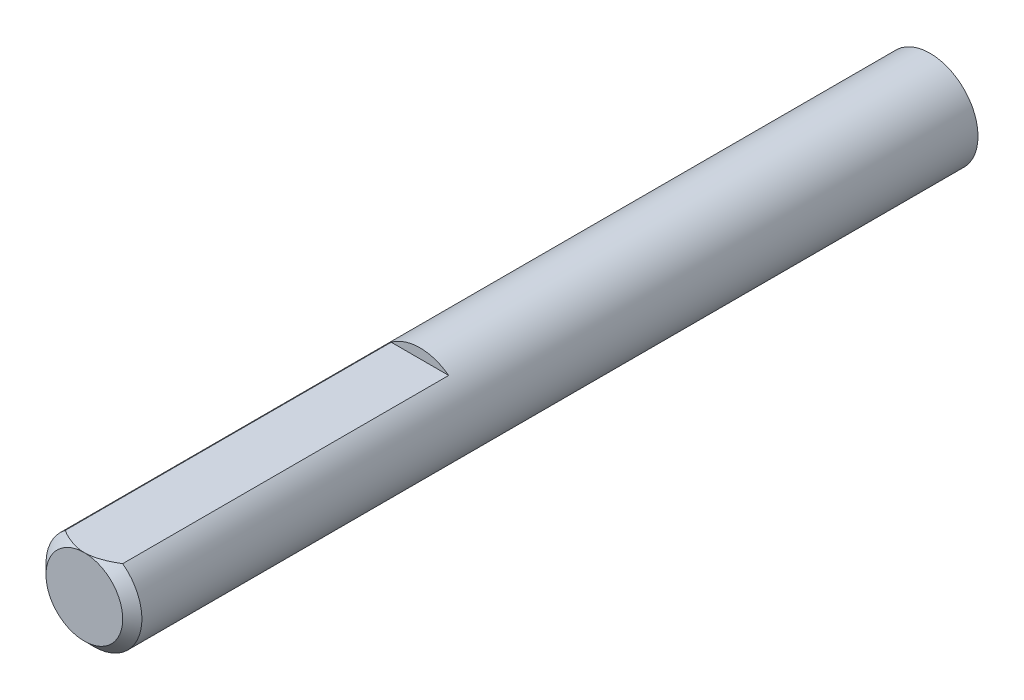
ISO-10303-21;
HEADER;
FILE_DESCRIPTION(('STEP AP214'),'2;1');
FILE_NAME('part.step','',(''),(''),'','','');
FILE_SCHEMA(('AUTOMOTIVE_DESIGN { 1 0 10303 214 1 1 1 1 }'));
ENDSEC;
DATA;
#1=APPLICATION_CONTEXT('core data for automotive mechanical design processes');
#2=APPLICATION_PROTOCOL_DEFINITION('international standard','automotive_design',2000,#1);
#3=PRODUCT_CONTEXT('',#1,'mechanical');
#4=PRODUCT('Part','Part','',(#3));
#5=PRODUCT_RELATED_PRODUCT_CATEGORY('part','',(#4));
#6=PRODUCT_DEFINITION_FORMATION('','',#4);
#7=PRODUCT_DEFINITION_CONTEXT('part definition',#1,'design');
#8=PRODUCT_DEFINITION('design','',#6,#7);
#9=PRODUCT_DEFINITION_SHAPE('','',#8);
#10=(LENGTH_UNIT() NAMED_UNIT(*) SI_UNIT(.MILLI.,.METRE.));
#11=(NAMED_UNIT(*) PLANE_ANGLE_UNIT() SI_UNIT($,.RADIAN.));
#12=(NAMED_UNIT(*) SI_UNIT($,.STERADIAN.) SOLID_ANGLE_UNIT());
#13=UNCERTAINTY_MEASURE_WITH_UNIT(LENGTH_MEASURE(1.E-05),#10,'distance_accuracy_value','');
#14=(GEOMETRIC_REPRESENTATION_CONTEXT(3) GLOBAL_UNCERTAINTY_ASSIGNED_CONTEXT((#13)) GLOBAL_UNIT_ASSIGNED_CONTEXT((#10,
#11,#12)) REPRESENTATION_CONTEXT('',''));
#15=CARTESIAN_POINT('',(0.,0.,0.));
#16=DIRECTION('',(0.,0.,1.));
#17=DIRECTION('',(1.,0.,0.));
#18=AXIS2_PLACEMENT_3D('',#15,#16,#17);
#19=CARTESIAN_POINT('',(0.,0.,44.1));
#20=DIRECTION('',(0.,0.,-1.));
#21=DIRECTION('',(-1.,0.,0.));
#22=AXIS2_PLACEMENT_3D('',#19,#20,#21);
#23=CYLINDRICAL_SURFACE('',#22,2.5);
#24=CARTESIAN_POINT('',(0.,0.,43.6));
#25=DIRECTION('',(0.,0.,1.));
#26=DIRECTION('',(1.,0.,0.));
#27=AXIS2_PLACEMENT_3D('',#24,#25,#26);
#28=CIRCLE('',#27,2.5);
#29=CARTESIAN_POINT('',(1.5,2.,43.6));
#30=VERTEX_POINT('',#29);
#31=CARTESIAN_POINT('',(-1.50000000000003,2.,43.6));
#32=VERTEX_POINT('',#31);
#33=EDGE_CURVE('E78',#30,#32,#28,.F.);
#34=ORIENTED_EDGE('',*,*,#33,.T.);
#35=DIRECTION('',(0.,0.,-1.));
#36=VECTOR('',#35,1.);
#37=CARTESIAN_POINT('',(-1.5,2.,44.1));
#38=LINE('',#37,#36);
#39=CARTESIAN_POINT('',(-1.5,2.,26.6));
#40=VERTEX_POINT('',#39);
#41=EDGE_CURVE('E58',#32,#40,#38,.T.);
#42=ORIENTED_EDGE('',*,*,#41,.T.);
#43=CARTESIAN_POINT('',(0.,0.,26.6));
#44=DIRECTION('',(0.,0.,-1.));
#45=DIRECTION('',(-1.,0.,0.));
#46=AXIS2_PLACEMENT_3D('',#43,#44,#45);
#47=CIRCLE('',#46,2.5);
#48=CARTESIAN_POINT('',(1.5,2.,26.6));
#49=VERTEX_POINT('',#48);
#50=EDGE_CURVE('E13',#40,#49,#47,.T.);
#51=ORIENTED_EDGE('',*,*,#50,.T.);
#52=DIRECTION('',(0.,0.,-1.));
#53=VECTOR('',#52,1.);
#54=CARTESIAN_POINT('',(1.5,2.,44.1));
#55=LINE('',#54,#53);
#56=EDGE_CURVE('E73',#49,#30,#55,.F.);
#57=ORIENTED_EDGE('',*,*,#56,.T.);
#58=EDGE_LOOP('',(#34,#42,#51,#57));
#59=FACE_BOUND('',#58,.T.);
#60=CARTESIAN_POINT('',(0.,0.,0.));
#61=DIRECTION('',(0.,0.,1.));
#62=DIRECTION('',(1.,0.,0.));
#63=AXIS2_PLACEMENT_3D('',#60,#61,#62);
#64=CIRCLE('',#63,2.5);
#65=CARTESIAN_POINT('',(2.5,0.,0.));
#66=VERTEX_POINT('',#65);
#67=EDGE_CURVE('E79',#66,#66,#64,.T.);
#68=ORIENTED_EDGE('',*,*,#67,.T.);
#69=EDGE_LOOP('',(#68));
#70=FACE_BOUND('',#69,.T.);
#71=ADVANCED_FACE('F38',(#59,#70),#23,.T.);
#72=CARTESIAN_POINT('',(0.,0.,44.1));
#73=DIRECTION('',(0.,0.,1.));
#74=DIRECTION('',(1.,0.,0.));
#75=AXIS2_PLACEMENT_3D('',#72,#73,#74);
#76=PLANE('',#75);
#77=CARTESIAN_POINT('',(0.,0.,44.1));
#78=DIRECTION('',(0.,0.,1.));
#79=DIRECTION('',(1.,0.,0.));
#80=AXIS2_PLACEMENT_3D('',#77,#78,#79);
#81=CIRCLE('',#80,2.);
#82=CARTESIAN_POINT('',(0.,2.,44.1));
#83=VERTEX_POINT('',#82);
#84=EDGE_CURVE('E82',#83,#83,#81,.T.);
#85=ORIENTED_EDGE('',*,*,#84,.T.);
#86=EDGE_LOOP('',(#85));
#87=FACE_BOUND('',#86,.T.);
#88=ADVANCED_FACE('F98',(#87),#76,.T.);
#89=CARTESIAN_POINT('',(0.,0.,0.));
#90=DIRECTION('',(0.,0.,1.));
#91=DIRECTION('',(1.,0.,0.));
#92=AXIS2_PLACEMENT_3D('',#89,#90,#91);
#93=PLANE('',#92);
#94=ORIENTED_EDGE('',*,*,#67,.F.);
#95=EDGE_LOOP('',(#94));
#96=FACE_BOUND('',#95,.T.);
#97=ADVANCED_FACE('F101',(#96),#93,.F.);
#98=CARTESIAN_POINT('',(0.,0.,44.1));
#99=DIRECTION('',(0.,0.,-1.));
#100=DIRECTION('',(-1.,0.,0.));
#101=AXIS2_PLACEMENT_3D('',#98,#99,#100);
#102=CONICAL_SURFACE('',#101,2.,0.785398163397448);
#103=CARTESIAN_POINT('',(-4.02524487287734,2.,41.6052701653353));
#104=CARTESIAN_POINT('',(-3.93338656559504,2.,41.6875217206694));
#105=CARTESIAN_POINT('',(-3.84126127996535,2.,41.7694777630483));
#106=CARTESIAN_POINT('',(-3.65633622016194,2.,41.9326420150682));
#107=CARTESIAN_POINT('',(-3.56353638507524,2.,42.0138501556327));
#108=CARTESIAN_POINT('',(-3.3767906548413,2.,42.1756480230057));
#109=CARTESIAN_POINT('',(-3.28284177522377,2.,42.2562343111819));
#110=CARTESIAN_POINT('',(-3.0939617004644,2.,42.416241356936));
#111=CARTESIAN_POINT('',(-2.99903054598731,2.,42.4956621624367));
#112=CARTESIAN_POINT('',(-2.80231868574972,2.,42.6576618695362));
#113=CARTESIAN_POINT('',(-2.70046395811371,2.,42.7401511403073));
#114=CARTESIAN_POINT('',(-2.49502065799542,2.,42.9029394966641));
#115=CARTESIAN_POINT('',(-2.39143218029122,2.,42.9832387013461));
#116=CARTESIAN_POINT('',(-2.18217141569414,2.,43.1407552208728));
#117=CARTESIAN_POINT('',(-2.07650249233658,2.,43.2179769835108));
#118=CARTESIAN_POINT('',(-1.86228016066993,2.,43.3682890730739));
#119=CARTESIAN_POINT('',(-1.75372763555551,2.,43.4413806440337));
#120=CARTESIAN_POINT('',(-1.56257875752937,2.,43.5627220691165));
#121=CARTESIAN_POINT('',(-1.48086803544078,2.,43.6123596167979));
#122=CARTESIAN_POINT('',(-1.31495821323154,2.,43.7074104299911));
#123=CARTESIAN_POINT('',(-1.23075822227053,2.,43.7528221584837));
#124=CARTESIAN_POINT('',(-1.06023902355461,2.,43.8375500940182));
#125=CARTESIAN_POINT('',(-0.973945152787862,2.,43.8769166708474));
#126=CARTESIAN_POINT('',(-0.798278775330236,2.,43.9480658869434));
#127=CARTESIAN_POINT('',(-0.708908734252925,2.,43.9798544452973));
#128=CARTESIAN_POINT('',(-0.559541387776273,2.,44.0239554616646));
#129=CARTESIAN_POINT('',(-0.500403045428476,2.,44.0391736445886));
#130=CARTESIAN_POINT('',(-0.381108626655472,2.,44.0648450536554));
#131=CARTESIAN_POINT('',(-0.32095297878292,2.,44.075300236847));
#132=CARTESIAN_POINT('',(-0.200181452597913,2.,44.0908949804001));
#133=CARTESIAN_POINT('',(-0.139568224383832,2.,44.0960547746351));
#134=CARTESIAN_POINT('',(-0.0181203079270951,2.,44.1008382229008));
#135=CARTESIAN_POINT('',(0.0427143780219909,2.,44.1004619341048));
#136=CARTESIAN_POINT('',(0.163839037596735,2.,44.094208583769));
#137=CARTESIAN_POINT('',(0.224130225918223,2.,44.0883546366807));
#138=CARTESIAN_POINT('',(0.343991547443575,2.,44.0715015109566));
#139=CARTESIAN_POINT('',(0.403561514966874,2.,44.0605011722532));
#140=CARTESIAN_POINT('',(0.52234223460209,2.,44.0337349239597));
#141=CARTESIAN_POINT('',(0.581540567552814,2.,44.0179146042934));
#142=CARTESIAN_POINT('',(0.69867136538083,2.,43.9822112796639));
#143=CARTESIAN_POINT('',(0.75660405011916,2.,43.9623289866356));
#144=CARTESIAN_POINT('',(0.88786092774522,2.,43.9128560581075));
#145=CARTESIAN_POINT('',(0.960752844289929,2.,43.88212449841));
#146=CARTESIAN_POINT('',(1.10449637010203,2.,43.8161808969026));
#147=CARTESIAN_POINT('',(1.17534687727419,2.,43.7809664885297));
#148=CARTESIAN_POINT('',(1.31542984339308,2.,43.7069247865524));
#149=CARTESIAN_POINT('',(1.38465593395358,2.,43.6680855391967));
#150=CARTESIAN_POINT('',(1.52149299869854,2.,43.5876549997551));
#151=CARTESIAN_POINT('',(1.58910373202633,2.,43.5460633007095));
#152=CARTESIAN_POINT('',(1.71962468526396,2.,43.462821493367));
#153=CARTESIAN_POINT('',(1.78260199281833,2.,43.4212760281911));
#154=CARTESIAN_POINT('',(1.90748425118695,2.,43.3365978718585));
#155=CARTESIAN_POINT('',(1.96938911660698,2.,43.293465055154));
#156=CARTESIAN_POINT('',(2.09174110166184,2.,43.2062912155001));
#157=CARTESIAN_POINT('',(2.15219622437864,2.,43.1622613860915));
#158=CARTESIAN_POINT('',(2.27230748022896,2.,43.0731570679659));
#159=CARTESIAN_POINT('',(2.33196382265286,2.,43.0280828616877));
#160=CARTESIAN_POINT('',(2.39129047517805,2.,42.9825859856802));
#161=B_SPLINE_CURVE_WITH_KNOTS('',3,(#103,#104,#105,#106,#107,#108,#109,#110,#111,#112,#113,
#114,#115,#116,#117,#118,#119,#120,#121,#122,#123,#124,#125,#126,#127,#128,#129,#130,#131,#132,
#133,#134,#135,#136,#137,#138,#139,#140,#141,#142,#143,#144,#145,#146,#147,#148,#149,#150,#151,
#152,#153,#154,#155,#156,#157,#158,#159,#160),.UNSPECIFIED.,.F.,.F.,(4,2,2,2,2,2,2,2,2,2,2,2,2,
2,2,2,2,2,2,2,2,2,2,2,2,2,2,2,4),(0.,0.369906577290639,0.739846983359822,1.11116790415774,
1.48247351382389,1.87565592605,2.26881691411833,2.66138738129621,3.05383896694484,
3.3405655856176,3.6273960884676,3.91168916131591,4.19575944375506,4.37878987167406,
4.56174502701619,4.74399847152469,4.92625003382967,5.10773598829822,5.28926287192775,
5.47292001224292,5.65654499086524,5.89365897291805,6.13089865416212,6.36895036811945,
6.60703735784734,6.83334806436321,7.05967670901761,7.2840325541635,7.50832841730334),.UNSPECIFIED.);
#162=EDGE_CURVE('E47',#32,#83,#161,.T.);
#163=ORIENTED_EDGE('',*,*,#162,.F.);
#164=ORIENTED_EDGE('',*,*,#33,.F.);
#165=EDGE_CURVE('E88',#83,#30,#161,.T.);
#166=ORIENTED_EDGE('',*,*,#165,.F.);
#167=ORIENTED_EDGE('',*,*,#84,.F.);
#168=EDGE_LOOP('',(#163,#164,#166,#167));
#169=FACE_BOUND('',#168,.T.);
#170=ADVANCED_FACE('F40',(#169),#102,.T.);
#171=CARTESIAN_POINT('',(0.,0.,26.6));
#172=DIRECTION('',(0.,0.,-1.));
#173=DIRECTION('',(-1.,0.,0.));
#174=AXIS2_PLACEMENT_3D('',#171,#172,#173);
#175=PLANE('',#174);
#176=DIRECTION('',(1.,0.,0.));
#177=VECTOR('',#176,1.);
#178=CARTESIAN_POINT('',(-2.54414840852252,2.,26.6));
#179=LINE('',#178,#177);
#180=EDGE_CURVE('E69',#40,#49,#179,.T.);
#181=ORIENTED_EDGE('',*,*,#180,.T.);
#182=ORIENTED_EDGE('',*,*,#50,.F.);
#183=EDGE_LOOP('',(#181,#182));
#184=FACE_BOUND('',#183,.T.);
#185=ADVANCED_FACE('F68',(#184),#175,.F.);
#186=CARTESIAN_POINT('',(-2.54414840852252,2.,26.6));
#187=DIRECTION('',(0.,-1.,0.));
#188=DIRECTION('',(0.,0.,-1.));
#189=AXIS2_PLACEMENT_3D('',#186,#187,#188);
#190=PLANE('',#189);
#191=ORIENTED_EDGE('',*,*,#162,.T.);
#192=ORIENTED_EDGE('',*,*,#165,.T.);
#193=ORIENTED_EDGE('',*,*,#56,.F.);
#194=ORIENTED_EDGE('',*,*,#180,.F.);
#195=ORIENTED_EDGE('',*,*,#41,.F.);
#196=EDGE_LOOP('',(#191,#192,#193,#194,#195));
#197=FACE_BOUND('',#196,.T.);
#198=ADVANCED_FACE('F72',(#197),#190,.F.);
#199=CLOSED_SHELL('',(#71,#88,#97,#170,#185,#198));
#200=MANIFOLD_SOLID_BREP('B2',#199);
#201=ADVANCED_BREP_SHAPE_REPRESENTATION('',(#18,#200),#14);
#202=SHAPE_DEFINITION_REPRESENTATION(#9,#201);
ENDSEC;
END-ISO-10303-21;
